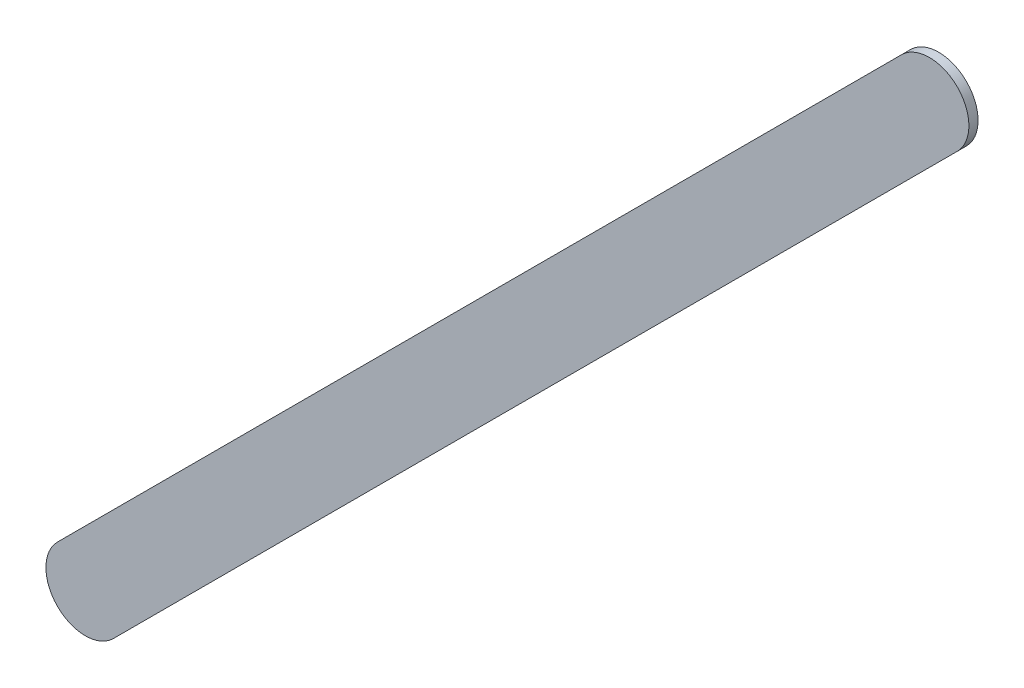
ISO-10303-21;
HEADER;
FILE_DESCRIPTION(('STEP AP214'),'2;1');
FILE_NAME('part.step','',(''),(''),'','','');
FILE_SCHEMA(('AUTOMOTIVE_DESIGN { 1 0 10303 214 1 1 1 1 }'));
ENDSEC;
DATA;
#1=APPLICATION_CONTEXT('core data for automotive mechanical design processes');
#2=APPLICATION_PROTOCOL_DEFINITION('international standard','automotive_design',2000,#1);
#3=PRODUCT_CONTEXT('',#1,'mechanical');
#4=PRODUCT('Part','Part','',(#3));
#5=PRODUCT_RELATED_PRODUCT_CATEGORY('part','',(#4));
#6=PRODUCT_DEFINITION_FORMATION('','',#4);
#7=PRODUCT_DEFINITION_CONTEXT('part definition',#1,'design');
#8=PRODUCT_DEFINITION('design','',#6,#7);
#9=PRODUCT_DEFINITION_SHAPE('','',#8);
#10=(LENGTH_UNIT() NAMED_UNIT(*) SI_UNIT(.MILLI.,.METRE.));
#11=(NAMED_UNIT(*) PLANE_ANGLE_UNIT() SI_UNIT($,.RADIAN.));
#12=(NAMED_UNIT(*) SI_UNIT($,.STERADIAN.) SOLID_ANGLE_UNIT());
#13=UNCERTAINTY_MEASURE_WITH_UNIT(LENGTH_MEASURE(1.E-05),#10,'distance_accuracy_value','');
#14=(GEOMETRIC_REPRESENTATION_CONTEXT(3) GLOBAL_UNCERTAINTY_ASSIGNED_CONTEXT((#13)) GLOBAL_UNIT_ASSIGNED_CONTEXT((#10,
#11,#12)) REPRESENTATION_CONTEXT('',''));
#15=CARTESIAN_POINT('',(0.,0.,0.));
#16=DIRECTION('',(0.,0.,1.));
#17=DIRECTION('',(1.,0.,0.));
#18=AXIS2_PLACEMENT_3D('',#15,#16,#17);
#19=CARTESIAN_POINT('',(124.893933,-74.693933,1.635));
#20=DIRECTION('',(0.,0.,1.));
#21=DIRECTION('',(1.,0.,0.));
#22=AXIS2_PLACEMENT_3D('',#19,#20,#21);
#23=PLANE('',#22);
#24=DIRECTION('',(-0.707106781186548,-0.707106781186548,0.));
#25=VECTOR('',#24,1.);
#26=CARTESIAN_POINT('',(124.893933,-74.693933,1.635));
#27=LINE('',#26,#25);
#28=CARTESIAN_POINT('',(124.893933,-74.693933,1.635));
#29=VERTEX_POINT('',#28);
#30=CARTESIAN_POINT('',(121.683933,-77.903933,1.635));
#31=VERTEX_POINT('',#30);
#32=EDGE_CURVE('E82',#29,#31,#27,.T.);
#33=ORIENTED_EDGE('',*,*,#32,.T.);
#34=CARTESIAN_POINT('',(121.7899995,-78.0099995,1.635));
#35=DIRECTION('',(0.,0.,1.));
#36=DIRECTION('',(-0.707106781186548,0.707106781186548,0.));
#37=AXIS2_PLACEMENT_3D('',#34,#35,#36);
#38=CIRCLE('',#37,0.150000682813);
#39=CARTESIAN_POINT('',(121.896066,-78.116066,1.635));
#40=VERTEX_POINT('',#39);
#41=EDGE_CURVE('E102',#31,#40,#38,.T.);
#42=ORIENTED_EDGE('',*,*,#41,.T.);
#43=DIRECTION('',(0.707106781186548,0.707106781186548,0.));
#44=VECTOR('',#43,1.);
#45=CARTESIAN_POINT('',(121.896066,-78.116066,1.635));
#46=LINE('',#45,#44);
#47=CARTESIAN_POINT('',(125.106066,-74.906066,1.635));
#48=VERTEX_POINT('',#47);
#49=EDGE_CURVE('E75',#40,#48,#46,.T.);
#50=ORIENTED_EDGE('',*,*,#49,.T.);
#51=CARTESIAN_POINT('',(124.9999995,-74.7999995,1.635));
#52=DIRECTION('',(0.,0.,1.));
#53=DIRECTION('',(0.707106781186548,-0.707106781186548,0.));
#54=AXIS2_PLACEMENT_3D('',#51,#52,#53);
#55=CIRCLE('',#54,0.150000682813);
#56=EDGE_CURVE('E11',#48,#29,#55,.T.);
#57=ORIENTED_EDGE('',*,*,#56,.T.);
#58=EDGE_LOOP('',(#33,#42,#50,#57));
#59=FACE_BOUND('',#58,.T.);
#60=ADVANCED_FACE('F17',(#59),#23,.T.);
#61=CARTESIAN_POINT('',(124.893933,-74.693933,1.6));
#62=DIRECTION('',(0.,0.,1.));
#63=DIRECTION('',(1.,0.,0.));
#64=AXIS2_PLACEMENT_3D('',#61,#62,#63);
#65=PLANE('',#64);
#66=CARTESIAN_POINT('',(124.9999995,-74.7999995,1.6));
#67=DIRECTION('',(0.,0.,1.));
#68=DIRECTION('',(0.707106781186548,-0.707106781186548,0.));
#69=AXIS2_PLACEMENT_3D('',#66,#67,#68);
#70=CIRCLE('',#69,0.150000682813);
#71=CARTESIAN_POINT('',(125.106066,-74.906066,1.6));
#72=VERTEX_POINT('',#71);
#73=CARTESIAN_POINT('',(124.893933,-74.693933,1.6));
#74=VERTEX_POINT('',#73);
#75=EDGE_CURVE('E20',#72,#74,#70,.T.);
#76=ORIENTED_EDGE('',*,*,#75,.F.);
#77=DIRECTION('',(0.707106781186548,0.707106781186548,0.));
#78=VECTOR('',#77,1.);
#79=CARTESIAN_POINT('',(121.896066,-78.116066,1.6));
#80=LINE('',#79,#78);
#81=CARTESIAN_POINT('',(121.896066,-78.116066,1.6));
#82=VERTEX_POINT('',#81);
#83=EDGE_CURVE('E106',#82,#72,#80,.T.);
#84=ORIENTED_EDGE('',*,*,#83,.F.);
#85=CARTESIAN_POINT('',(121.7899995,-78.0099995,1.6));
#86=DIRECTION('',(0.,0.,1.));
#87=DIRECTION('',(-0.707106781186548,0.707106781186548,0.));
#88=AXIS2_PLACEMENT_3D('',#85,#86,#87);
#89=CIRCLE('',#88,0.150000682813);
#90=CARTESIAN_POINT('',(121.683933,-77.903933,1.6));
#91=VERTEX_POINT('',#90);
#92=EDGE_CURVE('E84',#91,#82,#89,.T.);
#93=ORIENTED_EDGE('',*,*,#92,.F.);
#94=DIRECTION('',(-0.707106781186548,-0.707106781186548,0.));
#95=VECTOR('',#94,1.);
#96=CARTESIAN_POINT('',(124.893933,-74.693933,1.6));
#97=LINE('',#96,#95);
#98=EDGE_CURVE('E80',#74,#91,#97,.T.);
#99=ORIENTED_EDGE('',*,*,#98,.F.);
#100=EDGE_LOOP('',(#76,#84,#93,#99));
#101=FACE_BOUND('',#100,.T.);
#102=ADVANCED_FACE('F86',(#101),#65,.F.);
#103=CARTESIAN_POINT('',(124.9999995,-74.7999995,1.6));
#104=DIRECTION('',(0.,0.,-1.));
#105=DIRECTION('',(0.707106781186548,-0.707106781186548,0.));
#106=AXIS2_PLACEMENT_3D('',#103,#104,#105);
#107=CYLINDRICAL_SURFACE('',#106,0.150000682813);
#108=ORIENTED_EDGE('',*,*,#75,.T.);
#109=DIRECTION('',(0.,0.,1.));
#110=VECTOR('',#109,1.);
#111=CARTESIAN_POINT('',(124.893933,-74.693933,1.6));
#112=LINE('',#111,#110);
#113=EDGE_CURVE('E69',#74,#29,#112,.T.);
#114=ORIENTED_EDGE('',*,*,#113,.T.);
#115=ORIENTED_EDGE('',*,*,#56,.F.);
#116=DIRECTION('',(0.,0.,1.));
#117=VECTOR('',#116,1.);
#118=CARTESIAN_POINT('',(125.106066,-74.906066,1.6));
#119=LINE('',#118,#117);
#120=EDGE_CURVE('E72',#72,#48,#119,.T.);
#121=ORIENTED_EDGE('',*,*,#120,.F.);
#122=EDGE_LOOP('',(#108,#114,#115,#121));
#123=FACE_BOUND('',#122,.T.);
#124=ADVANCED_FACE('F68',(#123),#107,.T.);
#125=CARTESIAN_POINT('',(121.896066,-78.116066,1.6));
#126=DIRECTION('',(-0.707106781186548,0.707106781186548,0.));
#127=DIRECTION('',(0.,0.,1.));
#128=AXIS2_PLACEMENT_3D('',#125,#126,#127);
#129=PLANE('',#128);
#130=ORIENTED_EDGE('',*,*,#83,.T.);
#131=ORIENTED_EDGE('',*,*,#120,.T.);
#132=ORIENTED_EDGE('',*,*,#49,.F.);
#133=DIRECTION('',(0.,0.,1.));
#134=VECTOR('',#133,1.);
#135=CARTESIAN_POINT('',(121.896066,-78.116066,1.6));
#136=LINE('',#135,#134);
#137=EDGE_CURVE('E107',#82,#40,#136,.T.);
#138=ORIENTED_EDGE('',*,*,#137,.F.);
#139=EDGE_LOOP('',(#130,#131,#132,#138));
#140=FACE_BOUND('',#139,.T.);
#141=ADVANCED_FACE('F118',(#140),#129,.F.);
#142=CARTESIAN_POINT('',(121.7899995,-78.0099995,1.6));
#143=DIRECTION('',(0.,0.,-1.));
#144=DIRECTION('',(-0.707106781186548,0.707106781186548,0.));
#145=AXIS2_PLACEMENT_3D('',#142,#143,#144);
#146=CYLINDRICAL_SURFACE('',#145,0.150000682813);
#147=ORIENTED_EDGE('',*,*,#92,.T.);
#148=ORIENTED_EDGE('',*,*,#137,.T.);
#149=ORIENTED_EDGE('',*,*,#41,.F.);
#150=DIRECTION('',(0.,0.,1.));
#151=VECTOR('',#150,1.);
#152=CARTESIAN_POINT('',(121.683933,-77.903933,1.6));
#153=LINE('',#152,#151);
#154=EDGE_CURVE('E90',#91,#31,#153,.T.);
#155=ORIENTED_EDGE('',*,*,#154,.F.);
#156=EDGE_LOOP('',(#147,#148,#149,#155));
#157=FACE_BOUND('',#156,.T.);
#158=ADVANCED_FACE('F121',(#157),#146,.T.);
#159=CARTESIAN_POINT('',(124.893933,-74.693933,1.6));
#160=DIRECTION('',(0.707106781186548,-0.707106781186548,0.));
#161=DIRECTION('',(0.,0.,-1.));
#162=AXIS2_PLACEMENT_3D('',#159,#160,#161);
#163=PLANE('',#162);
#164=ORIENTED_EDGE('',*,*,#98,.T.);
#165=ORIENTED_EDGE('',*,*,#154,.T.);
#166=ORIENTED_EDGE('',*,*,#32,.F.);
#167=ORIENTED_EDGE('',*,*,#113,.F.);
#168=EDGE_LOOP('',(#164,#165,#166,#167));
#169=FACE_BOUND('',#168,.T.);
#170=ADVANCED_FACE('F78',(#169),#163,.F.);
#171=CLOSED_SHELL('',(#60,#102,#124,#141,#158,#170));
#172=MANIFOLD_SOLID_BREP('B1',#171);
#173=ADVANCED_BREP_SHAPE_REPRESENTATION('',(#18,#172),#14);
#174=SHAPE_DEFINITION_REPRESENTATION(#9,#173);
ENDSEC;
END-ISO-10303-21;
